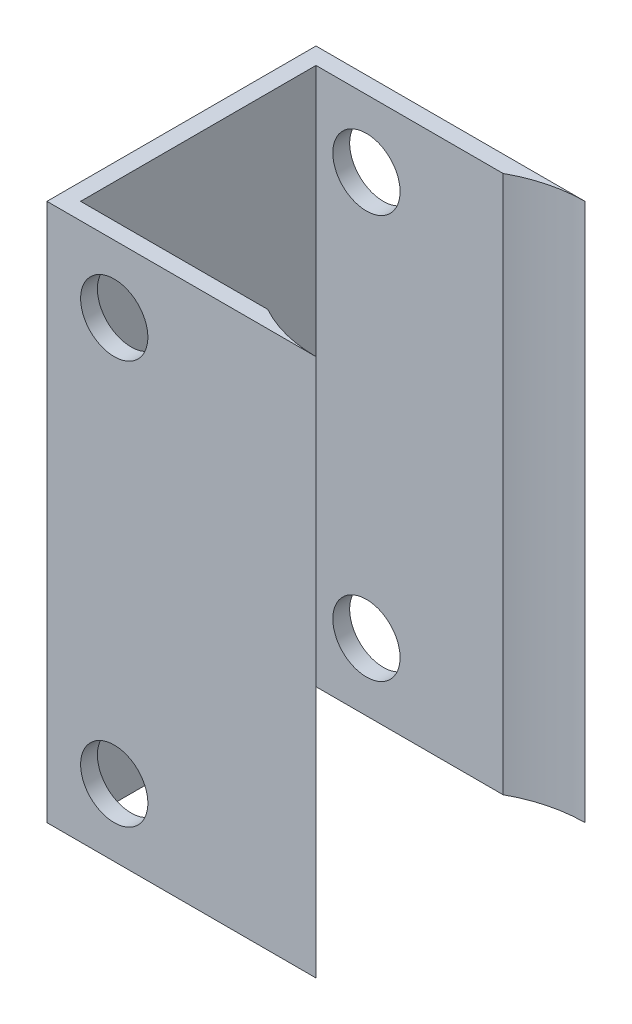
ISO-10303-21;
HEADER;
FILE_DESCRIPTION(('STEP AP214'),'2;1');
FILE_NAME('part.step','',(''),(''),'','','');
FILE_SCHEMA(('AUTOMOTIVE_DESIGN { 1 0 10303 214 1 1 1 1 }'));
ENDSEC;
DATA;
#1=APPLICATION_CONTEXT('core data for automotive mechanical design processes');
#2=APPLICATION_PROTOCOL_DEFINITION('international standard','automotive_design',2000,#1);
#3=PRODUCT_CONTEXT('',#1,'mechanical');
#4=PRODUCT('Part','Part','',(#3));
#5=PRODUCT_RELATED_PRODUCT_CATEGORY('part','',(#4));
#6=PRODUCT_DEFINITION_FORMATION('','',#4);
#7=PRODUCT_DEFINITION_CONTEXT('part definition',#1,'design');
#8=PRODUCT_DEFINITION('design','',#6,#7);
#9=PRODUCT_DEFINITION_SHAPE('','',#8);
#10=(LENGTH_UNIT() NAMED_UNIT(*) SI_UNIT(.MILLI.,.METRE.));
#11=(NAMED_UNIT(*) PLANE_ANGLE_UNIT() SI_UNIT($,.RADIAN.));
#12=(NAMED_UNIT(*) SI_UNIT($,.STERADIAN.) SOLID_ANGLE_UNIT());
#13=UNCERTAINTY_MEASURE_WITH_UNIT(LENGTH_MEASURE(1.E-05),#10,'distance_accuracy_value','');
#14=(GEOMETRIC_REPRESENTATION_CONTEXT(3) GLOBAL_UNCERTAINTY_ASSIGNED_CONTEXT((#13)) GLOBAL_UNIT_ASSIGNED_CONTEXT((#10,
#11,#12)) REPRESENTATION_CONTEXT('',''));
#15=CARTESIAN_POINT('',(0.,0.,0.));
#16=DIRECTION('',(0.,0.,1.));
#17=DIRECTION('',(1.,0.,0.));
#18=AXIS2_PLACEMENT_3D('',#15,#16,#17);
#19=CARTESIAN_POINT('',(0.,50.8,0.));
#20=DIRECTION('',(0.,1.,0.));
#21=DIRECTION('',(0.,0.,1.));
#22=AXIS2_PLACEMENT_3D('',#19,#20,#21);
#23=PLANE('',#22);
#24=CARTESIAN_POINT('',(12.7,50.8,0.));
#25=DIRECTION('',(0.,1.,0.));
#26=DIRECTION('',(0.,0.,1.));
#27=AXIS2_PLACEMENT_3D('',#24,#25,#26);
#28=CIRCLE('',#27,12.7);
#29=CARTESIAN_POINT('',(12.7,50.8,-12.7));
#30=VERTEX_POINT('',#29);
#31=CARTESIAN_POINT('',(6.5516389378957,50.8,-11.1125));
#32=VERTEX_POINT('',#31);
#33=EDGE_CURVE('E63',#30,#32,#28,.T.);
#34=ORIENTED_EDGE('',*,*,#33,.F.);
#35=DIRECTION('',(-1.,0.,0.));
#36=VECTOR('',#35,1.);
#37=CARTESIAN_POINT('',(-12.7,50.8,-12.7));
#38=LINE('',#37,#36);
#39=CARTESIAN_POINT('',(-12.7,50.8,-12.7));
#40=VERTEX_POINT('',#39);
#41=EDGE_CURVE('E214',#30,#40,#38,.T.);
#42=ORIENTED_EDGE('',*,*,#41,.T.);
#43=DIRECTION('',(0.,0.,1.));
#44=VECTOR('',#43,1.);
#45=CARTESIAN_POINT('',(-12.7,50.8,-12.7));
#46=LINE('',#45,#44);
#47=CARTESIAN_POINT('',(-12.7,50.8,12.7));
#48=VERTEX_POINT('',#47);
#49=EDGE_CURVE('E124',#40,#48,#46,.T.);
#50=ORIENTED_EDGE('',*,*,#49,.T.);
#51=DIRECTION('',(1.,0.,0.));
#52=VECTOR('',#51,1.);
#53=CARTESIAN_POINT('',(-12.7,50.8,12.7));
#54=LINE('',#53,#52);
#55=CARTESIAN_POINT('',(12.7,50.8,12.7));
#56=VERTEX_POINT('',#55);
#57=EDGE_CURVE('E122',#48,#56,#54,.T.);
#58=ORIENTED_EDGE('',*,*,#57,.T.);
#59=CARTESIAN_POINT('',(6.55163893789571,50.8,11.1125));
#60=VERTEX_POINT('',#59);
#61=EDGE_CURVE('E110',#60,#56,#28,.T.);
#62=ORIENTED_EDGE('',*,*,#61,.F.);
#63=DIRECTION('',(1.,0.,0.));
#64=VECTOR('',#63,1.);
#65=CARTESIAN_POINT('',(-11.1125,50.8,11.1125));
#66=LINE('',#65,#64);
#67=CARTESIAN_POINT('',(-11.1125,50.8,11.1125));
#68=VERTEX_POINT('',#67);
#69=EDGE_CURVE('E194',#68,#60,#66,.T.);
#70=ORIENTED_EDGE('',*,*,#69,.F.);
#71=DIRECTION('',(0.,0.,1.));
#72=VECTOR('',#71,1.);
#73=CARTESIAN_POINT('',(-11.1125,50.8,-11.1125));
#74=LINE('',#73,#72);
#75=CARTESIAN_POINT('',(-11.1125,50.8,-11.1125));
#76=VERTEX_POINT('',#75);
#77=EDGE_CURVE('E189',#76,#68,#74,.T.);
#78=ORIENTED_EDGE('',*,*,#77,.F.);
#79=DIRECTION('',(-1.,0.,0.));
#80=VECTOR('',#79,1.);
#81=CARTESIAN_POINT('',(-11.1125,50.8,-11.1125));
#82=LINE('',#81,#80);
#83=EDGE_CURVE('E186',#32,#76,#82,.T.);
#84=ORIENTED_EDGE('',*,*,#83,.F.);
#85=EDGE_LOOP('',(#34,#42,#50,#58,#62,#70,#78,#84));
#86=FACE_BOUND('',#85,.T.);
#87=ADVANCED_FACE('F45',(#86),#23,.T.);
#88=CARTESIAN_POINT('',(0.,0.,0.));
#89=DIRECTION('',(0.,1.,0.));
#90=DIRECTION('',(0.,0.,1.));
#91=AXIS2_PLACEMENT_3D('',#88,#89,#90);
#92=PLANE('',#91);
#93=DIRECTION('',(-1.,0.,0.));
#94=VECTOR('',#93,1.);
#95=CARTESIAN_POINT('',(-12.7,0.,-12.7));
#96=LINE('',#95,#94);
#97=CARTESIAN_POINT('',(12.7,0.,-12.7));
#98=VERTEX_POINT('',#97);
#99=CARTESIAN_POINT('',(-12.7,0.,-12.7));
#100=VERTEX_POINT('',#99);
#101=EDGE_CURVE('E213',#98,#100,#96,.T.);
#102=ORIENTED_EDGE('',*,*,#101,.F.);
#103=CARTESIAN_POINT('',(12.7,0.,0.));
#104=DIRECTION('',(0.,1.,0.));
#105=DIRECTION('',(0.,0.,1.));
#106=AXIS2_PLACEMENT_3D('',#103,#104,#105);
#107=CIRCLE('',#106,12.7);
#108=CARTESIAN_POINT('',(6.5516389378957,0.,-11.1125));
#109=VERTEX_POINT('',#108);
#110=EDGE_CURVE('E180',#98,#109,#107,.T.);
#111=ORIENTED_EDGE('',*,*,#110,.T.);
#112=DIRECTION('',(-1.,0.,0.));
#113=VECTOR('',#112,1.);
#114=CARTESIAN_POINT('',(-11.1125,0.,-11.1125));
#115=LINE('',#114,#113);
#116=CARTESIAN_POINT('',(-11.1125,0.,-11.1125));
#117=VERTEX_POINT('',#116);
#118=EDGE_CURVE('E185',#109,#117,#115,.T.);
#119=ORIENTED_EDGE('',*,*,#118,.T.);
#120=DIRECTION('',(0.,0.,1.));
#121=VECTOR('',#120,1.);
#122=CARTESIAN_POINT('',(-11.1125,0.,-11.1125));
#123=LINE('',#122,#121);
#124=CARTESIAN_POINT('',(-11.1125,0.,11.1125));
#125=VERTEX_POINT('',#124);
#126=EDGE_CURVE('E200',#117,#125,#123,.T.);
#127=ORIENTED_EDGE('',*,*,#126,.T.);
#128=DIRECTION('',(1.,0.,0.));
#129=VECTOR('',#128,1.);
#130=CARTESIAN_POINT('',(-11.1125,0.,11.1125));
#131=LINE('',#130,#129);
#132=CARTESIAN_POINT('',(6.55163893789571,0.,11.1125));
#133=VERTEX_POINT('',#132);
#134=EDGE_CURVE('E190',#125,#133,#131,.T.);
#135=ORIENTED_EDGE('',*,*,#134,.T.);
#136=CARTESIAN_POINT('',(12.7,0.,12.7));
#137=VERTEX_POINT('',#136);
#138=EDGE_CURVE('E70',#133,#137,#107,.T.);
#139=ORIENTED_EDGE('',*,*,#138,.T.);
#140=DIRECTION('',(1.,0.,0.));
#141=VECTOR('',#140,1.);
#142=CARTESIAN_POINT('',(-12.7,0.,12.7));
#143=LINE('',#142,#141);
#144=CARTESIAN_POINT('',(-12.7,0.,12.7));
#145=VERTEX_POINT('',#144);
#146=EDGE_CURVE('E133',#145,#137,#143,.T.);
#147=ORIENTED_EDGE('',*,*,#146,.F.);
#148=DIRECTION('',(0.,0.,1.));
#149=VECTOR('',#148,1.);
#150=CARTESIAN_POINT('',(-12.7,0.,-12.7));
#151=LINE('',#150,#149);
#152=EDGE_CURVE('E220',#100,#145,#151,.T.);
#153=ORIENTED_EDGE('',*,*,#152,.F.);
#154=EDGE_LOOP('',(#102,#111,#119,#127,#135,#139,#147,#153));
#155=FACE_BOUND('',#154,.T.);
#156=ADVANCED_FACE('F229',(#155),#92,.F.);
#157=CARTESIAN_POINT('',(-12.7,50.8,-12.7));
#158=DIRECTION('',(0.,0.,1.));
#159=DIRECTION('',(1.,0.,0.));
#160=AXIS2_PLACEMENT_3D('',#157,#158,#159);
#161=PLANE('',#160);
#162=CARTESIAN_POINT('',(-6.35,44.45,-12.7));
#163=DIRECTION('',(0.,0.,-1.));
#164=DIRECTION('',(-1.,0.,0.));
#165=AXIS2_PLACEMENT_3D('',#162,#163,#164);
#166=CIRCLE('',#165,3.175);
#167=CARTESIAN_POINT('',(-9.525,44.45,-12.7));
#168=VERTEX_POINT('',#167);
#169=EDGE_CURVE('E160',#168,#168,#166,.T.);
#170=ORIENTED_EDGE('',*,*,#169,.F.);
#171=EDGE_LOOP('',(#170));
#172=FACE_BOUND('',#171,.T.);
#173=CARTESIAN_POINT('',(-6.35,6.34999999999999,-12.7));
#174=DIRECTION('',(0.,0.,-1.));
#175=DIRECTION('',(-1.,0.,0.));
#176=AXIS2_PLACEMENT_3D('',#173,#174,#175);
#177=CIRCLE('',#176,3.175);
#178=CARTESIAN_POINT('',(-9.525,6.34999999999999,-12.7));
#179=VERTEX_POINT('',#178);
#180=EDGE_CURVE('E166',#179,#179,#177,.T.);
#181=ORIENTED_EDGE('',*,*,#180,.F.);
#182=EDGE_LOOP('',(#181));
#183=FACE_BOUND('',#182,.T.);
#184=ORIENTED_EDGE('',*,*,#101,.T.);
#185=DIRECTION('',(0.,-1.,0.));
#186=VECTOR('',#185,1.);
#187=CARTESIAN_POINT('',(-12.7,50.8,-12.7));
#188=LINE('',#187,#186);
#189=EDGE_CURVE('E138',#40,#100,#188,.T.);
#190=ORIENTED_EDGE('',*,*,#189,.F.);
#191=ORIENTED_EDGE('',*,*,#41,.F.);
#192=DIRECTION('',(0.,-1.,0.));
#193=VECTOR('',#192,1.);
#194=CARTESIAN_POINT('',(12.7,50.8,-12.7));
#195=LINE('',#194,#193);
#196=EDGE_CURVE('E55',#30,#98,#195,.T.);
#197=ORIENTED_EDGE('',*,*,#196,.T.);
#198=EDGE_LOOP('',(#184,#190,#191,#197));
#199=FACE_BOUND('',#198,.T.);
#200=ADVANCED_FACE('F47',(#172,#183,#199),#161,.F.);
#201=CARTESIAN_POINT('',(-12.7,50.8,-12.7));
#202=DIRECTION('',(1.,0.,0.));
#203=DIRECTION('',(0.,0.,-1.));
#204=AXIS2_PLACEMENT_3D('',#201,#202,#203);
#205=PLANE('',#204);
#206=ORIENTED_EDGE('',*,*,#152,.T.);
#207=DIRECTION('',(0.,-1.,0.));
#208=VECTOR('',#207,1.);
#209=CARTESIAN_POINT('',(-12.7,50.8,12.7));
#210=LINE('',#209,#208);
#211=EDGE_CURVE('E135',#48,#145,#210,.T.);
#212=ORIENTED_EDGE('',*,*,#211,.F.);
#213=ORIENTED_EDGE('',*,*,#49,.F.);
#214=ORIENTED_EDGE('',*,*,#189,.T.);
#215=EDGE_LOOP('',(#206,#212,#213,#214));
#216=FACE_BOUND('',#215,.T.);
#217=ADVANCED_FACE('F225',(#216),#205,.F.);
#218=CARTESIAN_POINT('',(-12.7,50.8,12.7));
#219=DIRECTION('',(0.,0.,-1.));
#220=DIRECTION('',(-1.,0.,0.));
#221=AXIS2_PLACEMENT_3D('',#218,#219,#220);
#222=PLANE('',#221);
#223=CARTESIAN_POINT('',(-6.35,44.45,12.7));
#224=DIRECTION('',(0.,0.,-1.));
#225=DIRECTION('',(-1.,0.,0.));
#226=AXIS2_PLACEMENT_3D('',#223,#224,#225);
#227=CIRCLE('',#226,3.175);
#228=CARTESIAN_POINT('',(-9.525,44.45,12.7));
#229=VERTEX_POINT('',#228);
#230=EDGE_CURVE('E152',#229,#229,#227,.T.);
#231=ORIENTED_EDGE('',*,*,#230,.T.);
#232=EDGE_LOOP('',(#231));
#233=FACE_BOUND('',#232,.T.);
#234=CARTESIAN_POINT('',(-6.35,6.34999999999999,12.7));
#235=DIRECTION('',(0.,0.,-1.));
#236=DIRECTION('',(-1.,0.,0.));
#237=AXIS2_PLACEMENT_3D('',#234,#235,#236);
#238=CIRCLE('',#237,3.175);
#239=CARTESIAN_POINT('',(-9.525,6.34999999999999,12.7));
#240=VERTEX_POINT('',#239);
#241=EDGE_CURVE('E172',#240,#240,#238,.T.);
#242=ORIENTED_EDGE('',*,*,#241,.T.);
#243=EDGE_LOOP('',(#242));
#244=FACE_BOUND('',#243,.T.);
#245=ORIENTED_EDGE('',*,*,#146,.T.);
#246=DIRECTION('',(0.,-1.,0.));
#247=VECTOR('',#246,1.);
#248=CARTESIAN_POINT('',(12.7,50.8,12.7));
#249=LINE('',#248,#247);
#250=EDGE_CURVE('E114',#56,#137,#249,.T.);
#251=ORIENTED_EDGE('',*,*,#250,.F.);
#252=ORIENTED_EDGE('',*,*,#57,.F.);
#253=ORIENTED_EDGE('',*,*,#211,.T.);
#254=EDGE_LOOP('',(#245,#251,#252,#253));
#255=FACE_BOUND('',#254,.T.);
#256=ADVANCED_FACE('F131',(#233,#244,#255),#222,.F.);
#257=CARTESIAN_POINT('',(-11.1125,50.8,-11.1125));
#258=DIRECTION('',(0.,0.,1.));
#259=DIRECTION('',(1.,0.,0.));
#260=AXIS2_PLACEMENT_3D('',#257,#258,#259);
#261=PLANE('',#260);
#262=CARTESIAN_POINT('',(-6.35,44.45,-11.1125));
#263=DIRECTION('',(0.,0.,1.));
#264=DIRECTION('',(1.,0.,0.));
#265=AXIS2_PLACEMENT_3D('',#262,#263,#264);
#266=CIRCLE('',#265,3.175);
#267=CARTESIAN_POINT('',(-3.175,44.45,-11.1125));
#268=VERTEX_POINT('',#267);
#269=EDGE_CURVE('E119',#268,#268,#266,.T.);
#270=ORIENTED_EDGE('',*,*,#269,.F.);
#271=EDGE_LOOP('',(#270));
#272=FACE_BOUND('',#271,.T.);
#273=CARTESIAN_POINT('',(-6.35,6.34999999999999,-11.1125));
#274=DIRECTION('',(0.,0.,1.));
#275=DIRECTION('',(1.,0.,0.));
#276=AXIS2_PLACEMENT_3D('',#273,#274,#275);
#277=CIRCLE('',#276,3.175);
#278=CARTESIAN_POINT('',(-3.175,6.34999999999999,-11.1125));
#279=VERTEX_POINT('',#278);
#280=EDGE_CURVE('E151',#279,#279,#277,.T.);
#281=ORIENTED_EDGE('',*,*,#280,.F.);
#282=EDGE_LOOP('',(#281));
#283=FACE_BOUND('',#282,.T.);
#284=DIRECTION('',(0.,1.,0.));
#285=VECTOR('',#284,1.);
#286=CARTESIAN_POINT('',(6.5516389378957,0.,-11.1125));
#287=LINE('',#286,#285);
#288=EDGE_CURVE('E182',#32,#109,#287,.F.);
#289=ORIENTED_EDGE('',*,*,#288,.F.);
#290=ORIENTED_EDGE('',*,*,#83,.T.);
#291=DIRECTION('',(0.,-1.,0.));
#292=VECTOR('',#291,1.);
#293=CARTESIAN_POINT('',(-11.1125,50.8,-11.1125));
#294=LINE('',#293,#292);
#295=EDGE_CURVE('E209',#76,#117,#294,.T.);
#296=ORIENTED_EDGE('',*,*,#295,.T.);
#297=ORIENTED_EDGE('',*,*,#118,.F.);
#298=EDGE_LOOP('',(#289,#290,#296,#297));
#299=FACE_BOUND('',#298,.T.);
#300=ADVANCED_FACE('F241',(#272,#283,#299),#261,.T.);
#301=CARTESIAN_POINT('',(-11.1125,50.8,-11.1125));
#302=DIRECTION('',(1.,0.,0.));
#303=DIRECTION('',(0.,0.,-1.));
#304=AXIS2_PLACEMENT_3D('',#301,#302,#303);
#305=PLANE('',#304);
#306=ORIENTED_EDGE('',*,*,#126,.F.);
#307=ORIENTED_EDGE('',*,*,#295,.F.);
#308=ORIENTED_EDGE('',*,*,#77,.T.);
#309=DIRECTION('',(0.,-1.,0.));
#310=VECTOR('',#309,1.);
#311=CARTESIAN_POINT('',(-11.1125,50.8,11.1125));
#312=LINE('',#311,#310);
#313=EDGE_CURVE('E197',#68,#125,#312,.T.);
#314=ORIENTED_EDGE('',*,*,#313,.T.);
#315=EDGE_LOOP('',(#306,#307,#308,#314));
#316=FACE_BOUND('',#315,.T.);
#317=ADVANCED_FACE('F238',(#316),#305,.T.);
#318=CARTESIAN_POINT('',(-11.1125,50.8,11.1125));
#319=DIRECTION('',(0.,0.,-1.));
#320=DIRECTION('',(-1.,0.,0.));
#321=AXIS2_PLACEMENT_3D('',#318,#319,#320);
#322=PLANE('',#321);
#323=CARTESIAN_POINT('',(-6.35,44.45,11.1125));
#324=DIRECTION('',(0.,0.,-1.));
#325=DIRECTION('',(-1.,0.,0.));
#326=AXIS2_PLACEMENT_3D('',#323,#324,#325);
#327=CIRCLE('',#326,3.175);
#328=CARTESIAN_POINT('',(-9.525,44.45,11.1125));
#329=VERTEX_POINT('',#328);
#330=EDGE_CURVE('E49',#329,#329,#327,.T.);
#331=ORIENTED_EDGE('',*,*,#330,.F.);
#332=EDGE_LOOP('',(#331));
#333=FACE_BOUND('',#332,.T.);
#334=CARTESIAN_POINT('',(-6.35,6.34999999999999,11.1125));
#335=DIRECTION('',(0.,0.,-1.));
#336=DIRECTION('',(-1.,0.,0.));
#337=AXIS2_PLACEMENT_3D('',#334,#335,#336);
#338=CIRCLE('',#337,3.175);
#339=CARTESIAN_POINT('',(-9.525,6.34999999999999,11.1125));
#340=VERTEX_POINT('',#339);
#341=EDGE_CURVE('E148',#340,#340,#338,.T.);
#342=ORIENTED_EDGE('',*,*,#341,.F.);
#343=EDGE_LOOP('',(#342));
#344=FACE_BOUND('',#343,.T.);
#345=DIRECTION('',(0.,1.,0.));
#346=VECTOR('',#345,1.);
#347=CARTESIAN_POINT('',(6.55163893789571,0.,11.1125));
#348=LINE('',#347,#346);
#349=EDGE_CURVE('E11',#133,#60,#348,.T.);
#350=ORIENTED_EDGE('',*,*,#349,.F.);
#351=ORIENTED_EDGE('',*,*,#134,.F.);
#352=ORIENTED_EDGE('',*,*,#313,.F.);
#353=ORIENTED_EDGE('',*,*,#69,.T.);
#354=EDGE_LOOP('',(#350,#351,#352,#353));
#355=FACE_BOUND('',#354,.T.);
#356=ADVANCED_FACE('F233',(#333,#344,#355),#322,.T.);
#357=CARTESIAN_POINT('',(12.7,0.,0.));
#358=DIRECTION('',(0.,1.,0.));
#359=DIRECTION('',(0.,0.,1.));
#360=AXIS2_PLACEMENT_3D('',#357,#358,#359);
#361=CYLINDRICAL_SURFACE('',#360,12.7);
#362=ORIENTED_EDGE('',*,*,#138,.F.);
#363=ORIENTED_EDGE('',*,*,#349,.T.);
#364=ORIENTED_EDGE('',*,*,#61,.T.);
#365=ORIENTED_EDGE('',*,*,#250,.T.);
#366=EDGE_LOOP('',(#362,#363,#364,#365));
#367=FACE_BOUND('',#366,.T.);
#368=ADVANCED_FACE('F112',(#367),#361,.F.);
#369=ORIENTED_EDGE('',*,*,#196,.F.);
#370=ORIENTED_EDGE('',*,*,#33,.T.);
#371=ORIENTED_EDGE('',*,*,#288,.T.);
#372=ORIENTED_EDGE('',*,*,#110,.F.);
#373=EDGE_LOOP('',(#369,#370,#371,#372));
#374=FACE_BOUND('',#373,.T.);
#375=ADVANCED_FACE('F243',(#374),#361,.F.);
#376=CARTESIAN_POINT('',(-6.35,6.34999999999999,12.7));
#377=DIRECTION('',(0.,0.,-1.));
#378=DIRECTION('',(-1.,0.,0.));
#379=AXIS2_PLACEMENT_3D('',#376,#377,#378);
#380=CYLINDRICAL_SURFACE('',#379,3.175);
#381=ORIENTED_EDGE('',*,*,#341,.T.);
#382=EDGE_LOOP('',(#381));
#383=FACE_BOUND('',#382,.T.);
#384=ORIENTED_EDGE('',*,*,#241,.F.);
#385=EDGE_LOOP('',(#384));
#386=FACE_BOUND('',#385,.T.);
#387=ADVANCED_FACE('F292',(#383,#386),#380,.F.);
#388=CARTESIAN_POINT('',(-6.35,44.45,12.7));
#389=DIRECTION('',(0.,0.,-1.));
#390=DIRECTION('',(-1.,0.,0.));
#391=AXIS2_PLACEMENT_3D('',#388,#389,#390);
#392=CYLINDRICAL_SURFACE('',#391,3.175);
#393=ORIENTED_EDGE('',*,*,#330,.T.);
#394=EDGE_LOOP('',(#393));
#395=FACE_BOUND('',#394,.T.);
#396=ORIENTED_EDGE('',*,*,#230,.F.);
#397=EDGE_LOOP('',(#396));
#398=FACE_BOUND('',#397,.T.);
#399=ADVANCED_FACE('F250',(#395,#398),#392,.F.);
#400=ORIENTED_EDGE('',*,*,#280,.T.);
#401=EDGE_LOOP('',(#400));
#402=FACE_BOUND('',#401,.T.);
#403=ORIENTED_EDGE('',*,*,#180,.T.);
#404=EDGE_LOOP('',(#403));
#405=FACE_BOUND('',#404,.T.);
#406=ADVANCED_FACE('F287',(#402,#405),#380,.F.);
#407=ORIENTED_EDGE('',*,*,#269,.T.);
#408=EDGE_LOOP('',(#407));
#409=FACE_BOUND('',#408,.T.);
#410=ORIENTED_EDGE('',*,*,#169,.T.);
#411=EDGE_LOOP('',(#410));
#412=FACE_BOUND('',#411,.T.);
#413=ADVANCED_FACE('F289',(#409,#412),#392,.F.);
#414=CLOSED_SHELL('',(#87,#156,#200,#217,#256,#300,#317,#356,#368,#375,#387,#399,#406,#413));
#415=MANIFOLD_SOLID_BREP('B2',#414);
#416=ADVANCED_BREP_SHAPE_REPRESENTATION('',(#18,#415),#14);
#417=SHAPE_DEFINITION_REPRESENTATION(#9,#416);
ENDSEC;
END-ISO-10303-21;
